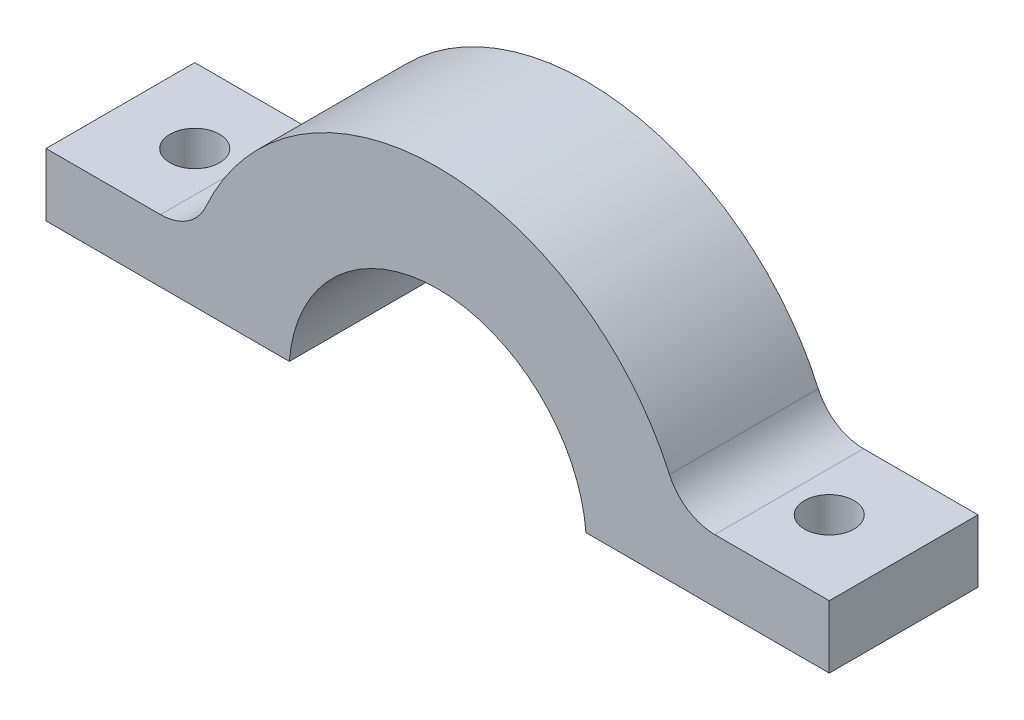
ISO-10303-21;
HEADER;
FILE_DESCRIPTION(('STEP AP214'),'2;1');
FILE_NAME('part.step','',(''),(''),'','','');
FILE_SCHEMA(('AUTOMOTIVE_DESIGN { 1 0 10303 214 1 1 1 1 }'));
ENDSEC;
DATA;
#1=APPLICATION_CONTEXT('core data for automotive mechanical design processes');
#2=APPLICATION_PROTOCOL_DEFINITION('international standard','automotive_design',2000,#1);
#3=PRODUCT_CONTEXT('',#1,'mechanical');
#4=PRODUCT('Part','Part','',(#3));
#5=PRODUCT_RELATED_PRODUCT_CATEGORY('part','',(#4));
#6=PRODUCT_DEFINITION_FORMATION('','',#4);
#7=PRODUCT_DEFINITION_CONTEXT('part definition',#1,'design');
#8=PRODUCT_DEFINITION('design','',#6,#7);
#9=PRODUCT_DEFINITION_SHAPE('','',#8);
#10=(LENGTH_UNIT() NAMED_UNIT(*) SI_UNIT(.MILLI.,.METRE.));
#11=(NAMED_UNIT(*) PLANE_ANGLE_UNIT() SI_UNIT($,.RADIAN.));
#12=(NAMED_UNIT(*) SI_UNIT($,.STERADIAN.) SOLID_ANGLE_UNIT());
#13=UNCERTAINTY_MEASURE_WITH_UNIT(LENGTH_MEASURE(1.E-05),#10,'distance_accuracy_value','');
#14=(GEOMETRIC_REPRESENTATION_CONTEXT(3) GLOBAL_UNCERTAINTY_ASSIGNED_CONTEXT((#13)) GLOBAL_UNIT_ASSIGNED_CONTEXT((#10,
#11,#12)) REPRESENTATION_CONTEXT('',''));
#15=CARTESIAN_POINT('',(0.,0.,0.));
#16=DIRECTION('',(0.,0.,1.));
#17=DIRECTION('',(1.,0.,0.));
#18=AXIS2_PLACEMENT_3D('',#15,#16,#17);
#19=CARTESIAN_POINT('',(0.,0.,30.));
#20=DIRECTION('',(0.,0.,-1.));
#21=DIRECTION('',(-1.,0.,0.));
#22=AXIS2_PLACEMENT_3D('',#19,#20,#21);
#23=CYLINDRICAL_SURFACE('',#22,51.2283896542713);
#24=CARTESIAN_POINT('',(0.,0.,0.));
#25=DIRECTION('',(0.,0.,1.));
#26=DIRECTION('',(1.,0.,0.));
#27=AXIS2_PLACEMENT_3D('',#24,#25,#26);
#28=CIRCLE('',#27,51.2283896542713);
#29=CARTESIAN_POINT('',(46.763555061045,20.9169267489863,0.));
#30=VERTEX_POINT('',#29);
#31=CARTESIAN_POINT('',(-46.763555061045,20.9169267489863,0.));
#32=VERTEX_POINT('',#31);
#33=EDGE_CURVE('E166',#30,#32,#28,.T.);
#34=ORIENTED_EDGE('',*,*,#33,.T.);
#35=DIRECTION('',(0.,0.,-1.));
#36=VECTOR('',#35,1.);
#37=CARTESIAN_POINT('',(-46.763555061045,20.9169267489863,30.));
#38=LINE('',#37,#36);
#39=CARTESIAN_POINT('',(-46.763555061045,20.9169267489863,30.));
#40=VERTEX_POINT('',#39);
#41=EDGE_CURVE('E219',#32,#40,#38,.F.);
#42=ORIENTED_EDGE('',*,*,#41,.T.);
#43=CARTESIAN_POINT('',(0.,0.,30.));
#44=DIRECTION('',(0.,0.,1.));
#45=DIRECTION('',(1.,0.,0.));
#46=AXIS2_PLACEMENT_3D('',#43,#44,#45);
#47=CIRCLE('',#46,51.2283896542713);
#48=CARTESIAN_POINT('',(46.763555061045,20.9169267489863,30.));
#49=VERTEX_POINT('',#48);
#50=EDGE_CURVE('E129',#49,#40,#47,.T.);
#51=ORIENTED_EDGE('',*,*,#50,.F.);
#52=DIRECTION('',(0.,0.,-1.));
#53=VECTOR('',#52,1.);
#54=CARTESIAN_POINT('',(46.763555061045,20.9169267489863,30.));
#55=LINE('',#54,#53);
#56=EDGE_CURVE('E215',#49,#30,#55,.T.);
#57=ORIENTED_EDGE('',*,*,#56,.T.);
#58=EDGE_LOOP('',(#34,#42,#51,#57));
#59=FACE_BOUND('',#58,.T.);
#60=ADVANCED_FACE('F39',(#59),#23,.T.);
#61=CARTESIAN_POINT('',(-48.9831390028227,15.,30.));
#62=DIRECTION('',(0.,-1.,0.));
#63=DIRECTION('',(1.,0.,0.));
#64=AXIS2_PLACEMENT_3D('',#61,#62,#63);
#65=PLANE('',#64);
#66=CARTESIAN_POINT('',(-63.9831390028227,15.,15.));
#67=DIRECTION('',(0.,1.,0.));
#68=DIRECTION('',(-1.,0.,0.));
#69=AXIS2_PLACEMENT_3D('',#66,#67,#68);
#70=CIRCLE('',#69,5.);
#71=CARTESIAN_POINT('',(-68.9831390028227,15.,15.));
#72=VERTEX_POINT('',#71);
#73=EDGE_CURVE('E291',#72,#72,#70,.T.);
#74=ORIENTED_EDGE('',*,*,#73,.F.);
#75=EDGE_LOOP('',(#74));
#76=FACE_BOUND('',#75,.T.);
#77=DIRECTION('',(-1.,0.,0.));
#78=VECTOR('',#77,1.);
#79=CARTESIAN_POINT('',(-48.9831390028227,15.,30.));
#80=LINE('',#79,#78);
#81=CARTESIAN_POINT('',(-55.8920003189658,15.,30.));
#82=VERTEX_POINT('',#81);
#83=CARTESIAN_POINT('',(-78.9831390028227,15.,30.));
#84=VERTEX_POINT('',#83);
#85=EDGE_CURVE('E116',#82,#84,#80,.T.);
#86=ORIENTED_EDGE('',*,*,#85,.F.);
#87=DIRECTION('',(0.,0.,1.));
#88=VECTOR('',#87,1.);
#89=CARTESIAN_POINT('',(-55.8920003189658,15.,0.));
#90=LINE('',#89,#88);
#91=CARTESIAN_POINT('',(-55.8920003189658,15.,0.));
#92=VERTEX_POINT('',#91);
#93=EDGE_CURVE('E140',#82,#92,#90,.F.);
#94=ORIENTED_EDGE('',*,*,#93,.T.);
#95=DIRECTION('',(-1.,0.,0.));
#96=VECTOR('',#95,1.);
#97=CARTESIAN_POINT('',(-48.9831390028227,15.,0.));
#98=LINE('',#97,#96);
#99=CARTESIAN_POINT('',(-78.9831390028227,15.,0.));
#100=VERTEX_POINT('',#99);
#101=EDGE_CURVE('E135',#92,#100,#98,.T.);
#102=ORIENTED_EDGE('',*,*,#101,.T.);
#103=DIRECTION('',(0.,0.,-1.));
#104=VECTOR('',#103,1.);
#105=CARTESIAN_POINT('',(-78.9831390028227,15.,30.));
#106=LINE('',#105,#104);
#107=EDGE_CURVE('E132',#84,#100,#106,.T.);
#108=ORIENTED_EDGE('',*,*,#107,.F.);
#109=EDGE_LOOP('',(#86,#94,#102,#108));
#110=FACE_BOUND('',#109,.T.);
#111=ADVANCED_FACE('F133',(#76,#110),#65,.F.);
#112=CARTESIAN_POINT('',(-78.9831390028227,15.,30.));
#113=DIRECTION('',(1.,0.,0.));
#114=DIRECTION('',(0.,0.,-1.));
#115=AXIS2_PLACEMENT_3D('',#112,#113,#114);
#116=PLANE('',#115);
#117=DIRECTION('',(0.,-1.,0.));
#118=VECTOR('',#117,1.);
#119=CARTESIAN_POINT('',(-78.9831390028227,15.,0.));
#120=LINE('',#119,#118);
#121=CARTESIAN_POINT('',(-78.9831390028227,2.34519954530178,0.));
#122=VERTEX_POINT('',#121);
#123=EDGE_CURVE('E173',#100,#122,#120,.T.);
#124=ORIENTED_EDGE('',*,*,#123,.T.);
#125=DIRECTION('',(0.,0.,-1.));
#126=VECTOR('',#125,1.);
#127=CARTESIAN_POINT('',(-78.9831390028227,2.34519954530178,30.));
#128=LINE('',#127,#126);
#129=CARTESIAN_POINT('',(-78.9831390028227,2.34519954530178,30.));
#130=VERTEX_POINT('',#129);
#131=EDGE_CURVE('E141',#130,#122,#128,.T.);
#132=ORIENTED_EDGE('',*,*,#131,.F.);
#133=DIRECTION('',(0.,-1.,0.));
#134=VECTOR('',#133,1.);
#135=CARTESIAN_POINT('',(-78.9831390028227,15.,30.));
#136=LINE('',#135,#134);
#137=EDGE_CURVE('E120',#84,#130,#136,.T.);
#138=ORIENTED_EDGE('',*,*,#137,.F.);
#139=ORIENTED_EDGE('',*,*,#107,.T.);
#140=EDGE_LOOP('',(#124,#132,#138,#139));
#141=FACE_BOUND('',#140,.T.);
#142=ADVANCED_FACE('F143',(#141),#116,.F.);
#143=CARTESIAN_POINT('',(-51.174680708946,2.34519954530178,30.));
#144=DIRECTION('',(0.,1.,0.));
#145=DIRECTION('',(0.,0.,1.));
#146=AXIS2_PLACEMENT_3D('',#143,#144,#145);
#147=PLANE('',#146);
#148=CARTESIAN_POINT('',(-63.9831390028227,2.34519954530178,15.));
#149=DIRECTION('',(0.,1.,0.));
#150=DIRECTION('',(0.,0.,1.));
#151=AXIS2_PLACEMENT_3D('',#148,#149,#150);
#152=CIRCLE('',#151,5.);
#153=CARTESIAN_POINT('',(-63.9831390028227,2.34519954530178,20.));
#154=VERTEX_POINT('',#153);
#155=EDGE_CURVE('E170',#154,#154,#152,.T.);
#156=ORIENTED_EDGE('',*,*,#155,.T.);
#157=EDGE_LOOP('',(#156));
#158=FACE_BOUND('',#157,.T.);
#159=DIRECTION('',(1.,0.,0.));
#160=VECTOR('',#159,1.);
#161=CARTESIAN_POINT('',(-51.174680708946,2.34519954530178,0.));
#162=LINE('',#161,#160);
#163=CARTESIAN_POINT('',(-29.9081935110216,2.34519954530177,0.));
#164=VERTEX_POINT('',#163);
#165=EDGE_CURVE('E176',#122,#164,#162,.T.);
#166=ORIENTED_EDGE('',*,*,#165,.T.);
#167=DIRECTION('',(0.,0.,-1.));
#168=VECTOR('',#167,1.);
#169=CARTESIAN_POINT('',(-29.9081935110216,2.34519954530177,30.));
#170=LINE('',#169,#168);
#171=CARTESIAN_POINT('',(-29.9081935110216,2.34519954530177,30.));
#172=VERTEX_POINT('',#171);
#173=EDGE_CURVE('E203',#172,#164,#170,.T.);
#174=ORIENTED_EDGE('',*,*,#173,.F.);
#175=DIRECTION('',(1.,0.,0.));
#176=VECTOR('',#175,1.);
#177=CARTESIAN_POINT('',(-78.9831390028227,2.34519954530178,30.));
#178=LINE('',#177,#176);
#179=EDGE_CURVE('E147',#130,#172,#178,.T.);
#180=ORIENTED_EDGE('',*,*,#179,.F.);
#181=ORIENTED_EDGE('',*,*,#131,.T.);
#182=EDGE_LOOP('',(#166,#174,#180,#181));
#183=FACE_BOUND('',#182,.T.);
#184=ADVANCED_FACE('F256',(#158,#183),#147,.F.);
#185=CARTESIAN_POINT('',(0.,0.,30.));
#186=DIRECTION('',(0.,0.,-1.));
#187=DIRECTION('',(-1.,0.,0.));
#188=AXIS2_PLACEMENT_3D('',#185,#186,#187);
#189=CYLINDRICAL_SURFACE('',#188,30.);
#190=CARTESIAN_POINT('',(0.,0.,0.));
#191=DIRECTION('',(0.,0.,-1.));
#192=DIRECTION('',(1.,0.,0.));
#193=AXIS2_PLACEMENT_3D('',#190,#191,#192);
#194=CIRCLE('',#193,30.);
#195=CARTESIAN_POINT('',(29.9081935110216,2.34519954530178,0.));
#196=VERTEX_POINT('',#195);
#197=EDGE_CURVE('E179',#164,#196,#194,.T.);
#198=ORIENTED_EDGE('',*,*,#197,.T.);
#199=DIRECTION('',(0.,0.,-1.));
#200=VECTOR('',#199,1.);
#201=CARTESIAN_POINT('',(29.9081935110216,2.34519954530178,30.));
#202=LINE('',#201,#200);
#203=CARTESIAN_POINT('',(29.9081935110216,2.34519954530178,30.));
#204=VERTEX_POINT('',#203);
#205=EDGE_CURVE('E199',#204,#196,#202,.T.);
#206=ORIENTED_EDGE('',*,*,#205,.F.);
#207=CARTESIAN_POINT('',(0.,0.,30.));
#208=DIRECTION('',(0.,0.,-1.));
#209=DIRECTION('',(1.,0.,0.));
#210=AXIS2_PLACEMENT_3D('',#207,#208,#209);
#211=CIRCLE('',#210,30.);
#212=EDGE_CURVE('E150',#172,#204,#211,.T.);
#213=ORIENTED_EDGE('',*,*,#212,.F.);
#214=ORIENTED_EDGE('',*,*,#173,.T.);
#215=EDGE_LOOP('',(#198,#206,#213,#214));
#216=FACE_BOUND('',#215,.T.);
#217=ADVANCED_FACE('F259',(#216),#189,.F.);
#218=CARTESIAN_POINT('',(51.174680708946,2.34519954530178,30.));
#219=DIRECTION('',(0.,1.,0.));
#220=DIRECTION('',(0.,0.,1.));
#221=AXIS2_PLACEMENT_3D('',#218,#219,#220);
#222=PLANE('',#221);
#223=CARTESIAN_POINT('',(63.9831390028227,2.34519954530178,15.));
#224=DIRECTION('',(0.,1.,0.));
#225=DIRECTION('',(0.,0.,1.));
#226=AXIS2_PLACEMENT_3D('',#223,#224,#225);
#227=CIRCLE('',#226,5.);
#228=CARTESIAN_POINT('',(63.9831390028227,2.34519954530178,20.));
#229=VERTEX_POINT('',#228);
#230=EDGE_CURVE('E212',#229,#229,#227,.T.);
#231=ORIENTED_EDGE('',*,*,#230,.T.);
#232=EDGE_LOOP('',(#231));
#233=FACE_BOUND('',#232,.T.);
#234=DIRECTION('',(1.,0.,0.));
#235=VECTOR('',#234,1.);
#236=CARTESIAN_POINT('',(51.174680708946,2.34519954530178,0.));
#237=LINE('',#236,#235);
#238=CARTESIAN_POINT('',(78.9831390028227,2.34519954530178,0.));
#239=VERTEX_POINT('',#238);
#240=EDGE_CURVE('E183',#196,#239,#237,.T.);
#241=ORIENTED_EDGE('',*,*,#240,.T.);
#242=DIRECTION('',(0.,0.,-1.));
#243=VECTOR('',#242,1.);
#244=CARTESIAN_POINT('',(78.9831390028227,2.34519954530178,30.));
#245=LINE('',#244,#243);
#246=CARTESIAN_POINT('',(78.9831390028227,2.34519954530178,30.));
#247=VERTEX_POINT('',#246);
#248=EDGE_CURVE('E195',#247,#239,#245,.T.);
#249=ORIENTED_EDGE('',*,*,#248,.F.);
#250=DIRECTION('',(1.,0.,0.));
#251=VECTOR('',#250,1.);
#252=CARTESIAN_POINT('',(29.9081935110216,2.34519954530178,30.));
#253=LINE('',#252,#251);
#254=EDGE_CURVE('E156',#204,#247,#253,.T.);
#255=ORIENTED_EDGE('',*,*,#254,.F.);
#256=ORIENTED_EDGE('',*,*,#205,.T.);
#257=EDGE_LOOP('',(#241,#249,#255,#256));
#258=FACE_BOUND('',#257,.T.);
#259=ADVANCED_FACE('F263',(#233,#258),#222,.F.);
#260=CARTESIAN_POINT('',(78.9831390028227,2.34519954530178,30.));
#261=DIRECTION('',(-1.,0.,0.));
#262=DIRECTION('',(0.,0.,1.));
#263=AXIS2_PLACEMENT_3D('',#260,#261,#262);
#264=PLANE('',#263);
#265=DIRECTION('',(0.,1.,0.));
#266=VECTOR('',#265,1.);
#267=CARTESIAN_POINT('',(78.9831390028227,2.34519954530178,0.));
#268=LINE('',#267,#266);
#269=CARTESIAN_POINT('',(78.9831390028227,15.,0.));
#270=VERTEX_POINT('',#269);
#271=EDGE_CURVE('E186',#239,#270,#268,.T.);
#272=ORIENTED_EDGE('',*,*,#271,.T.);
#273=DIRECTION('',(0.,0.,-1.));
#274=VECTOR('',#273,1.);
#275=CARTESIAN_POINT('',(78.9831390028227,15.,30.));
#276=LINE('',#275,#274);
#277=CARTESIAN_POINT('',(78.9831390028227,15.,30.));
#278=VERTEX_POINT('',#277);
#279=EDGE_CURVE('E165',#278,#270,#276,.T.);
#280=ORIENTED_EDGE('',*,*,#279,.F.);
#281=DIRECTION('',(0.,1.,0.));
#282=VECTOR('',#281,1.);
#283=CARTESIAN_POINT('',(78.9831390028227,2.34519954530178,30.));
#284=LINE('',#283,#282);
#285=EDGE_CURVE('E159',#247,#278,#284,.T.);
#286=ORIENTED_EDGE('',*,*,#285,.F.);
#287=ORIENTED_EDGE('',*,*,#248,.T.);
#288=EDGE_LOOP('',(#272,#280,#286,#287));
#289=FACE_BOUND('',#288,.T.);
#290=ADVANCED_FACE('F267',(#289),#264,.F.);
#291=CARTESIAN_POINT('',(48.9831390028227,15.,30.));
#292=DIRECTION('',(0.,-1.,0.));
#293=DIRECTION('',(0.,0.,-1.));
#294=AXIS2_PLACEMENT_3D('',#291,#292,#293);
#295=PLANE('',#294);
#296=CARTESIAN_POINT('',(63.9831390028227,15.,15.));
#297=DIRECTION('',(0.,1.,0.));
#298=DIRECTION('',(-1.,0.,0.));
#299=AXIS2_PLACEMENT_3D('',#296,#297,#298);
#300=CIRCLE('',#299,5.);
#301=CARTESIAN_POINT('',(58.9831390028227,15.,15.));
#302=VERTEX_POINT('',#301);
#303=EDGE_CURVE('E287',#302,#302,#300,.T.);
#304=ORIENTED_EDGE('',*,*,#303,.F.);
#305=EDGE_LOOP('',(#304));
#306=FACE_BOUND('',#305,.T.);
#307=DIRECTION('',(-1.,0.,0.));
#308=VECTOR('',#307,1.);
#309=CARTESIAN_POINT('',(48.9831390028227,15.,0.));
#310=LINE('',#309,#308);
#311=CARTESIAN_POINT('',(55.8920003189658,15.,0.));
#312=VERTEX_POINT('',#311);
#313=EDGE_CURVE('E189',#270,#312,#310,.T.);
#314=ORIENTED_EDGE('',*,*,#313,.T.);
#315=DIRECTION('',(0.,0.,1.));
#316=VECTOR('',#315,1.);
#317=CARTESIAN_POINT('',(55.8920003189658,15.,30.));
#318=LINE('',#317,#316);
#319=CARTESIAN_POINT('',(55.8920003189658,15.,30.));
#320=VERTEX_POINT('',#319);
#321=EDGE_CURVE('E55',#312,#320,#318,.T.);
#322=ORIENTED_EDGE('',*,*,#321,.T.);
#323=DIRECTION('',(-1.,0.,0.));
#324=VECTOR('',#323,1.);
#325=CARTESIAN_POINT('',(48.9831390028227,15.,30.));
#326=LINE('',#325,#324);
#327=EDGE_CURVE('E162',#278,#320,#326,.T.);
#328=ORIENTED_EDGE('',*,*,#327,.F.);
#329=ORIENTED_EDGE('',*,*,#279,.T.);
#330=EDGE_LOOP('',(#314,#322,#328,#329));
#331=FACE_BOUND('',#330,.T.);
#332=ADVANCED_FACE('F271',(#306,#331),#295,.F.);
#333=CARTESIAN_POINT('',(0.,0.,30.));
#334=DIRECTION('',(0.,0.,1.));
#335=DIRECTION('',(1.,0.,0.));
#336=AXIS2_PLACEMENT_3D('',#333,#334,#335);
#337=PLANE('',#336);
#338=ORIENTED_EDGE('',*,*,#327,.T.);
#339=CARTESIAN_POINT('',(55.8920003189658,25.,30.));
#340=DIRECTION('',(0.,0.,1.));
#341=DIRECTION('',(1.,0.,0.));
#342=AXIS2_PLACEMENT_3D('',#339,#340,#341);
#343=CIRCLE('',#342,10.);
#344=EDGE_CURVE('E11',#320,#49,#343,.F.);
#345=ORIENTED_EDGE('',*,*,#344,.T.);
#346=ORIENTED_EDGE('',*,*,#50,.T.);
#347=CARTESIAN_POINT('',(-55.8920003189658,25.,30.));
#348=DIRECTION('',(0.,0.,1.));
#349=DIRECTION('',(1.,0.,0.));
#350=AXIS2_PLACEMENT_3D('',#347,#348,#349);
#351=CIRCLE('',#350,10.);
#352=EDGE_CURVE('E124',#40,#82,#351,.F.);
#353=ORIENTED_EDGE('',*,*,#352,.T.);
#354=ORIENTED_EDGE('',*,*,#85,.T.);
#355=ORIENTED_EDGE('',*,*,#137,.T.);
#356=ORIENTED_EDGE('',*,*,#179,.T.);
#357=ORIENTED_EDGE('',*,*,#212,.T.);
#358=ORIENTED_EDGE('',*,*,#254,.T.);
#359=ORIENTED_EDGE('',*,*,#285,.T.);
#360=EDGE_LOOP('',(#338,#345,#346,#353,#354,#355,#356,#357,#358,#359));
#361=FACE_BOUND('',#360,.T.);
#362=ADVANCED_FACE('F118',(#361),#337,.T.);
#363=CARTESIAN_POINT('',(0.,0.,0.));
#364=DIRECTION('',(0.,0.,1.));
#365=DIRECTION('',(1.,0.,0.));
#366=AXIS2_PLACEMENT_3D('',#363,#364,#365);
#367=PLANE('',#366);
#368=ORIENTED_EDGE('',*,*,#33,.F.);
#369=CARTESIAN_POINT('',(55.8920003189658,25.,0.));
#370=DIRECTION('',(0.,0.,1.));
#371=DIRECTION('',(1.,0.,0.));
#372=AXIS2_PLACEMENT_3D('',#369,#370,#371);
#373=CIRCLE('',#372,10.);
#374=EDGE_CURVE('E48',#30,#312,#373,.T.);
#375=ORIENTED_EDGE('',*,*,#374,.T.);
#376=ORIENTED_EDGE('',*,*,#313,.F.);
#377=ORIENTED_EDGE('',*,*,#271,.F.);
#378=ORIENTED_EDGE('',*,*,#240,.F.);
#379=ORIENTED_EDGE('',*,*,#197,.F.);
#380=ORIENTED_EDGE('',*,*,#165,.F.);
#381=ORIENTED_EDGE('',*,*,#123,.F.);
#382=ORIENTED_EDGE('',*,*,#101,.F.);
#383=CARTESIAN_POINT('',(-55.8920003189658,25.,0.));
#384=DIRECTION('',(0.,0.,1.));
#385=DIRECTION('',(1.,0.,0.));
#386=AXIS2_PLACEMENT_3D('',#383,#384,#385);
#387=CIRCLE('',#386,10.);
#388=EDGE_CURVE('E224',#92,#32,#387,.T.);
#389=ORIENTED_EDGE('',*,*,#388,.T.);
#390=EDGE_LOOP('',(#368,#375,#376,#377,#378,#379,#380,#381,#382,#389));
#391=FACE_BOUND('',#390,.T.);
#392=ADVANCED_FACE('F229',(#391),#367,.F.);
#393=CARTESIAN_POINT('',(63.9831390028227,-15.,15.));
#394=DIRECTION('',(0.,1.,0.));
#395=DIRECTION('',(-1.,0.,0.));
#396=AXIS2_PLACEMENT_3D('',#393,#394,#395);
#397=CYLINDRICAL_SURFACE('',#396,5.);
#398=ORIENTED_EDGE('',*,*,#303,.T.);
#399=EDGE_LOOP('',(#398));
#400=FACE_BOUND('',#399,.T.);
#401=ORIENTED_EDGE('',*,*,#230,.F.);
#402=EDGE_LOOP('',(#401));
#403=FACE_BOUND('',#402,.T.);
#404=ADVANCED_FACE('F243',(#400,#403),#397,.F.);
#405=CARTESIAN_POINT('',(-63.9831390028227,-15.,15.));
#406=DIRECTION('',(0.,1.,0.));
#407=DIRECTION('',(-1.,0.,0.));
#408=AXIS2_PLACEMENT_3D('',#405,#406,#407);
#409=CYLINDRICAL_SURFACE('',#408,5.);
#410=ORIENTED_EDGE('',*,*,#73,.T.);
#411=EDGE_LOOP('',(#410));
#412=FACE_BOUND('',#411,.T.);
#413=ORIENTED_EDGE('',*,*,#155,.F.);
#414=EDGE_LOOP('',(#413));
#415=FACE_BOUND('',#414,.T.);
#416=ADVANCED_FACE('F237',(#412,#415),#409,.F.);
#417=CARTESIAN_POINT('',(-55.8920003189658,25.,30.));
#418=DIRECTION('',(0.,0.,-1.));
#419=DIRECTION('',(-1.,0.,0.));
#420=AXIS2_PLACEMENT_3D('',#417,#418,#419);
#421=CYLINDRICAL_SURFACE('',#420,10.);
#422=ORIENTED_EDGE('',*,*,#352,.F.);
#423=ORIENTED_EDGE('',*,*,#41,.F.);
#424=ORIENTED_EDGE('',*,*,#388,.F.);
#425=ORIENTED_EDGE('',*,*,#93,.F.);
#426=EDGE_LOOP('',(#422,#423,#424,#425));
#427=FACE_BOUND('',#426,.T.);
#428=ADVANCED_FACE('F235',(#427),#421,.F.);
#429=CARTESIAN_POINT('',(55.8920003189658,25.,30.));
#430=DIRECTION('',(0.,0.,-1.));
#431=DIRECTION('',(-1.,0.,0.));
#432=AXIS2_PLACEMENT_3D('',#429,#430,#431);
#433=CYLINDRICAL_SURFACE('',#432,10.);
#434=ORIENTED_EDGE('',*,*,#344,.F.);
#435=ORIENTED_EDGE('',*,*,#321,.F.);
#436=ORIENTED_EDGE('',*,*,#374,.F.);
#437=ORIENTED_EDGE('',*,*,#56,.F.);
#438=EDGE_LOOP('',(#434,#435,#436,#437));
#439=FACE_BOUND('',#438,.T.);
#440=ADVANCED_FACE('F41',(#439),#433,.F.);
#441=CLOSED_SHELL('',(#60,#111,#142,#184,#217,#259,#290,#332,#362,#392,#404,#416,#428,#440));
#442=MANIFOLD_SOLID_BREP('B2',#441);
#443=ADVANCED_BREP_SHAPE_REPRESENTATION('',(#18,#442),#14);
#444=SHAPE_DEFINITION_REPRESENTATION(#9,#443);
ENDSEC;
END-ISO-10303-21;
